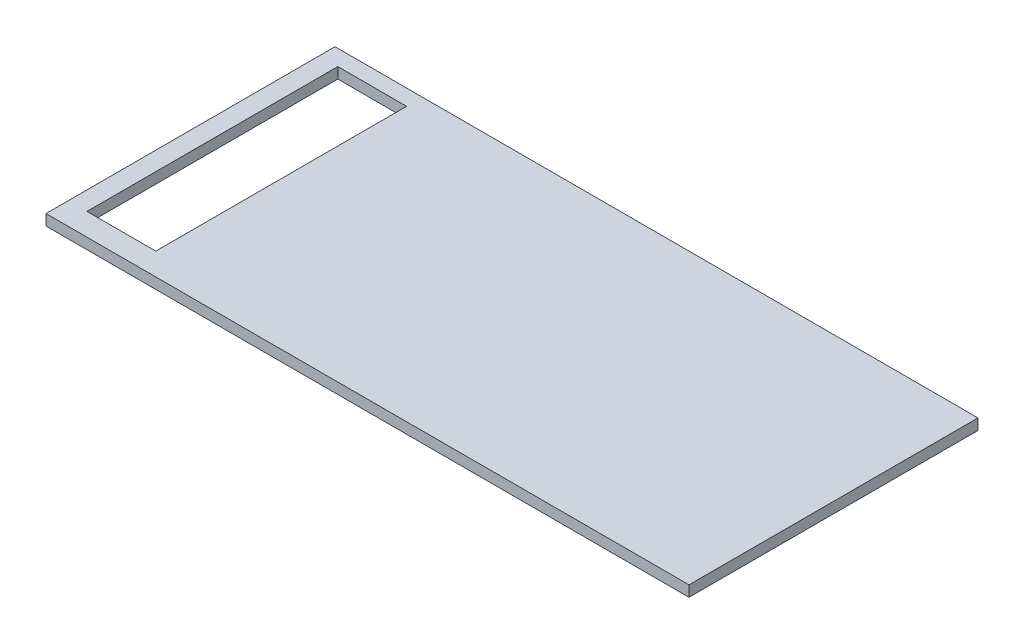
ISO-10303-21;
HEADER;
FILE_DESCRIPTION(('STEP AP214'),'2;1');
FILE_NAME('part.step','',(''),(''),'','','');
FILE_SCHEMA(('AUTOMOTIVE_DESIGN { 1 0 10303 214 1 1 1 1 }'));
ENDSEC;
DATA;
#1=APPLICATION_CONTEXT('core data for automotive mechanical design processes');
#2=APPLICATION_PROTOCOL_DEFINITION('international standard','automotive_design',2000,#1);
#3=PRODUCT_CONTEXT('',#1,'mechanical');
#4=PRODUCT('Part','Part','',(#3));
#5=PRODUCT_RELATED_PRODUCT_CATEGORY('part','',(#4));
#6=PRODUCT_DEFINITION_FORMATION('','',#4);
#7=PRODUCT_DEFINITION_CONTEXT('part definition',#1,'design');
#8=PRODUCT_DEFINITION('design','',#6,#7);
#9=PRODUCT_DEFINITION_SHAPE('','',#8);
#10=(LENGTH_UNIT() NAMED_UNIT(*) SI_UNIT(.MILLI.,.METRE.));
#11=(NAMED_UNIT(*) PLANE_ANGLE_UNIT() SI_UNIT($,.RADIAN.));
#12=(NAMED_UNIT(*) SI_UNIT($,.STERADIAN.) SOLID_ANGLE_UNIT());
#13=UNCERTAINTY_MEASURE_WITH_UNIT(LENGTH_MEASURE(1.E-05),#10,'distance_accuracy_value','');
#14=(GEOMETRIC_REPRESENTATION_CONTEXT(3) GLOBAL_UNCERTAINTY_ASSIGNED_CONTEXT((#13)) GLOBAL_UNIT_ASSIGNED_CONTEXT((#10,
#11,#12)) REPRESENTATION_CONTEXT('',''));
#15=CARTESIAN_POINT('',(0.,0.,0.));
#16=DIRECTION('',(0.,0.,1.));
#17=DIRECTION('',(1.,0.,0.));
#18=AXIS2_PLACEMENT_3D('',#15,#16,#17);
#19=CARTESIAN_POINT('',(0.,1.5,0.));
#20=DIRECTION('',(1.,0.,0.));
#21=DIRECTION('',(0.,0.,-1.));
#22=AXIS2_PLACEMENT_3D('',#19,#20,#21);
#23=PLANE('',#22);
#24=DIRECTION('',(0.,0.,1.));
#25=VECTOR('',#24,1.);
#26=CARTESIAN_POINT('',(0.,0.,0.));
#27=LINE('',#26,#25);
#28=CARTESIAN_POINT('',(0.,0.,-40.));
#29=VERTEX_POINT('',#28);
#30=CARTESIAN_POINT('',(0.,0.,0.));
#31=VERTEX_POINT('',#30);
#32=EDGE_CURVE('E150',#29,#31,#27,.T.);
#33=ORIENTED_EDGE('',*,*,#32,.T.);
#34=DIRECTION('',(0.,-1.,0.));
#35=VECTOR('',#34,1.);
#36=CARTESIAN_POINT('',(0.,1.5,0.));
#37=LINE('',#36,#35);
#38=CARTESIAN_POINT('',(0.,1.5,0.));
#39=VERTEX_POINT('',#38);
#40=EDGE_CURVE('E11',#39,#31,#37,.T.);
#41=ORIENTED_EDGE('',*,*,#40,.F.);
#42=DIRECTION('',(0.,0.,1.));
#43=VECTOR('',#42,1.);
#44=CARTESIAN_POINT('',(0.,1.5,0.));
#45=LINE('',#44,#43);
#46=CARTESIAN_POINT('',(0.,1.5,-40.));
#47=VERTEX_POINT('',#46);
#48=EDGE_CURVE('E151',#47,#39,#45,.T.);
#49=ORIENTED_EDGE('',*,*,#48,.F.);
#50=DIRECTION('',(0.,-1.,0.));
#51=VECTOR('',#50,1.);
#52=CARTESIAN_POINT('',(0.,1.5,-40.));
#53=LINE('',#52,#51);
#54=EDGE_CURVE('E165',#47,#29,#53,.T.);
#55=ORIENTED_EDGE('',*,*,#54,.T.);
#56=EDGE_LOOP('',(#33,#41,#49,#55));
#57=FACE_BOUND('',#56,.T.);
#58=ADVANCED_FACE('F39',(#57),#23,.F.);
#59=CARTESIAN_POINT('',(0.,1.5,0.));
#60=DIRECTION('',(0.,0.,-1.));
#61=DIRECTION('',(-1.,0.,0.));
#62=AXIS2_PLACEMENT_3D('',#59,#60,#61);
#63=PLANE('',#62);
#64=DIRECTION('',(1.,0.,0.));
#65=VECTOR('',#64,1.);
#66=CARTESIAN_POINT('',(0.,0.,0.));
#67=LINE('',#66,#65);
#68=CARTESIAN_POINT('',(89.,0.,0.));
#69=VERTEX_POINT('',#68);
#70=EDGE_CURVE('E169',#31,#69,#67,.T.);
#71=ORIENTED_EDGE('',*,*,#70,.T.);
#72=DIRECTION('',(0.,-1.,0.));
#73=VECTOR('',#72,1.);
#74=CARTESIAN_POINT('',(89.,1.5,0.));
#75=LINE('',#74,#73);
#76=CARTESIAN_POINT('',(89.,1.5,0.));
#77=VERTEX_POINT('',#76);
#78=EDGE_CURVE('E47',#77,#69,#75,.T.);
#79=ORIENTED_EDGE('',*,*,#78,.F.);
#80=DIRECTION('',(1.,0.,0.));
#81=VECTOR('',#80,1.);
#82=CARTESIAN_POINT('',(0.,1.5,0.));
#83=LINE('',#82,#81);
#84=EDGE_CURVE('E155',#39,#77,#83,.T.);
#85=ORIENTED_EDGE('',*,*,#84,.F.);
#86=ORIENTED_EDGE('',*,*,#40,.T.);
#87=EDGE_LOOP('',(#71,#79,#85,#86));
#88=FACE_BOUND('',#87,.T.);
#89=ADVANCED_FACE('F203',(#88),#63,.F.);
#90=CARTESIAN_POINT('',(89.,1.5,0.));
#91=DIRECTION('',(-1.,0.,0.));
#92=DIRECTION('',(0.,0.,1.));
#93=AXIS2_PLACEMENT_3D('',#90,#91,#92);
#94=PLANE('',#93);
#95=DIRECTION('',(0.,0.,-1.));
#96=VECTOR('',#95,1.);
#97=CARTESIAN_POINT('',(89.,0.,0.));
#98=LINE('',#97,#96);
#99=CARTESIAN_POINT('',(89.,0.,-40.));
#100=VERTEX_POINT('',#99);
#101=EDGE_CURVE('E172',#69,#100,#98,.T.);
#102=ORIENTED_EDGE('',*,*,#101,.T.);
#103=DIRECTION('',(0.,-1.,0.));
#104=VECTOR('',#103,1.);
#105=CARTESIAN_POINT('',(89.,1.5,-40.));
#106=LINE('',#105,#104);
#107=CARTESIAN_POINT('',(89.,1.5,-40.));
#108=VERTEX_POINT('',#107);
#109=EDGE_CURVE('E180',#108,#100,#106,.T.);
#110=ORIENTED_EDGE('',*,*,#109,.F.);
#111=DIRECTION('',(0.,0.,-1.));
#112=VECTOR('',#111,1.);
#113=CARTESIAN_POINT('',(89.,1.5,0.));
#114=LINE('',#113,#112);
#115=EDGE_CURVE('E159',#77,#108,#114,.T.);
#116=ORIENTED_EDGE('',*,*,#115,.F.);
#117=ORIENTED_EDGE('',*,*,#78,.T.);
#118=EDGE_LOOP('',(#102,#110,#116,#117));
#119=FACE_BOUND('',#118,.T.);
#120=ADVANCED_FACE('F189',(#119),#94,.F.);
#121=CARTESIAN_POINT('',(0.,1.5,-40.));
#122=DIRECTION('',(0.,0.,1.));
#123=DIRECTION('',(1.,0.,0.));
#124=AXIS2_PLACEMENT_3D('',#121,#122,#123);
#125=PLANE('',#124);
#126=DIRECTION('',(-1.,0.,0.));
#127=VECTOR('',#126,1.);
#128=CARTESIAN_POINT('',(0.,0.,-40.));
#129=LINE('',#128,#127);
#130=EDGE_CURVE('E156',#100,#29,#129,.T.);
#131=ORIENTED_EDGE('',*,*,#130,.T.);
#132=ORIENTED_EDGE('',*,*,#54,.F.);
#133=DIRECTION('',(-1.,0.,0.));
#134=VECTOR('',#133,1.);
#135=CARTESIAN_POINT('',(0.,1.5,-40.));
#136=LINE('',#135,#134);
#137=EDGE_CURVE('E162',#108,#47,#136,.T.);
#138=ORIENTED_EDGE('',*,*,#137,.F.);
#139=ORIENTED_EDGE('',*,*,#109,.T.);
#140=EDGE_LOOP('',(#131,#132,#138,#139));
#141=FACE_BOUND('',#140,.T.);
#142=ADVANCED_FACE('F196',(#141),#125,.F.);
#143=CARTESIAN_POINT('',(0.,1.5,0.));
#144=DIRECTION('',(0.,-1.,0.));
#145=DIRECTION('',(0.,0.,-1.));
#146=AXIS2_PLACEMENT_3D('',#143,#144,#145);
#147=PLANE('',#146);
#148=DIRECTION('',(0.,0.,-1.));
#149=VECTOR('',#148,1.);
#150=CARTESIAN_POINT('',(12.0989451914433,1.5,-37.8100523078331));
#151=LINE('',#150,#149);
#152=CARTESIAN_POINT('',(12.0989451914433,1.5,-3.0935188886474));
#153=VERTEX_POINT('',#152);
#154=CARTESIAN_POINT('',(12.0989451914433,1.5,-37.8100523078331));
#155=VERTEX_POINT('',#154);
#156=EDGE_CURVE('E132',#153,#155,#151,.T.);
#157=ORIENTED_EDGE('',*,*,#156,.F.);
#158=DIRECTION('',(1.,0.,0.));
#159=VECTOR('',#158,1.);
#160=CARTESIAN_POINT('',(2.57661766249839,1.5,-3.0935188886474));
#161=LINE('',#160,#159);
#162=CARTESIAN_POINT('',(2.57661766249839,1.5,-3.0935188886474));
#163=VERTEX_POINT('',#162);
#164=EDGE_CURVE('E122',#163,#153,#161,.T.);
#165=ORIENTED_EDGE('',*,*,#164,.F.);
#166=DIRECTION('',(0.,0.,1.));
#167=VECTOR('',#166,1.);
#168=CARTESIAN_POINT('',(2.57661766249839,1.5,-37.8100523078331));
#169=LINE('',#168,#167);
#170=CARTESIAN_POINT('',(2.57661766249839,1.5,-37.8100523078331));
#171=VERTEX_POINT('',#170);
#172=EDGE_CURVE('E136',#171,#163,#169,.T.);
#173=ORIENTED_EDGE('',*,*,#172,.F.);
#174=DIRECTION('',(-1.,0.,0.));
#175=VECTOR('',#174,1.);
#176=CARTESIAN_POINT('',(2.57661766249839,1.5,-37.8100523078331));
#177=LINE('',#176,#175);
#178=EDGE_CURVE('E54',#155,#171,#177,.T.);
#179=ORIENTED_EDGE('',*,*,#178,.F.);
#180=EDGE_LOOP('',(#157,#165,#173,#179));
#181=FACE_BOUND('',#180,.T.);
#182=ORIENTED_EDGE('',*,*,#48,.T.);
#183=ORIENTED_EDGE('',*,*,#84,.T.);
#184=ORIENTED_EDGE('',*,*,#115,.T.);
#185=ORIENTED_EDGE('',*,*,#137,.T.);
#186=EDGE_LOOP('',(#182,#183,#184,#185));
#187=FACE_BOUND('',#186,.T.);
#188=ADVANCED_FACE('F202',(#181,#187),#147,.F.);
#189=CARTESIAN_POINT('',(0.,0.,0.));
#190=DIRECTION('',(0.,-1.,0.));
#191=DIRECTION('',(0.,0.,-1.));
#192=AXIS2_PLACEMENT_3D('',#189,#190,#191);
#193=PLANE('',#192);
#194=DIRECTION('',(1.,0.,0.));
#195=VECTOR('',#194,1.);
#196=CARTESIAN_POINT('',(2.57661766249839,0.,-3.0935188886474));
#197=LINE('',#196,#195);
#198=CARTESIAN_POINT('',(2.57661766249839,0.,-3.0935188886474));
#199=VERTEX_POINT('',#198);
#200=CARTESIAN_POINT('',(12.0989451914433,0.,-3.0935188886474));
#201=VERTEX_POINT('',#200);
#202=EDGE_CURVE('E119',#199,#201,#197,.T.);
#203=ORIENTED_EDGE('',*,*,#202,.T.);
#204=DIRECTION('',(0.,0.,-1.));
#205=VECTOR('',#204,1.);
#206=CARTESIAN_POINT('',(12.0989451914433,0.,-37.8100523078331));
#207=LINE('',#206,#205);
#208=CARTESIAN_POINT('',(12.0989451914433,0.,-37.8100523078331));
#209=VERTEX_POINT('',#208);
#210=EDGE_CURVE('E105',#201,#209,#207,.T.);
#211=ORIENTED_EDGE('',*,*,#210,.T.);
#212=DIRECTION('',(-1.,0.,0.));
#213=VECTOR('',#212,1.);
#214=CARTESIAN_POINT('',(2.57661766249839,0.,-37.8100523078331));
#215=LINE('',#214,#213);
#216=CARTESIAN_POINT('',(2.57661766249839,0.,-37.8100523078331));
#217=VERTEX_POINT('',#216);
#218=EDGE_CURVE('E141',#209,#217,#215,.T.);
#219=ORIENTED_EDGE('',*,*,#218,.T.);
#220=DIRECTION('',(0.,0.,1.));
#221=VECTOR('',#220,1.);
#222=CARTESIAN_POINT('',(2.57661766249839,0.,-37.8100523078331));
#223=LINE('',#222,#221);
#224=EDGE_CURVE('E128',#217,#199,#223,.T.);
#225=ORIENTED_EDGE('',*,*,#224,.T.);
#226=EDGE_LOOP('',(#203,#211,#219,#225));
#227=FACE_BOUND('',#226,.T.);
#228=ORIENTED_EDGE('',*,*,#32,.F.);
#229=ORIENTED_EDGE('',*,*,#130,.F.);
#230=ORIENTED_EDGE('',*,*,#101,.F.);
#231=ORIENTED_EDGE('',*,*,#70,.F.);
#232=EDGE_LOOP('',(#228,#229,#230,#231));
#233=FACE_BOUND('',#232,.T.);
#234=ADVANCED_FACE('F126',(#227,#233),#193,.T.);
#235=CARTESIAN_POINT('',(2.57661766249839,-35.9987835101957,-3.0935188886474));
#236=DIRECTION('',(0.,0.,1.));
#237=DIRECTION('',(1.,0.,0.));
#238=AXIS2_PLACEMENT_3D('',#235,#236,#237);
#239=PLANE('',#238);
#240=DIRECTION('',(0.,1.,0.));
#241=VECTOR('',#240,1.);
#242=CARTESIAN_POINT('',(2.57661766249839,-35.9987835101957,-3.0935188886474));
#243=LINE('',#242,#241);
#244=EDGE_CURVE('E62',#199,#163,#243,.T.);
#245=ORIENTED_EDGE('',*,*,#244,.T.);
#246=ORIENTED_EDGE('',*,*,#164,.T.);
#247=DIRECTION('',(0.,1.,0.));
#248=VECTOR('',#247,1.);
#249=CARTESIAN_POINT('',(12.0989451914433,-35.9987835101957,-3.0935188886474));
#250=LINE('',#249,#248);
#251=EDGE_CURVE('E109',#201,#153,#250,.T.);
#252=ORIENTED_EDGE('',*,*,#251,.F.);
#253=ORIENTED_EDGE('',*,*,#202,.F.);
#254=EDGE_LOOP('',(#245,#246,#252,#253));
#255=FACE_BOUND('',#254,.T.);
#256=ADVANCED_FACE('F118',(#255),#239,.F.);
#257=CARTESIAN_POINT('',(12.0989451914433,-35.9987835101957,-37.8100523078331));
#258=DIRECTION('',(1.,0.,0.));
#259=DIRECTION('',(0.,0.,-1.));
#260=AXIS2_PLACEMENT_3D('',#257,#258,#259);
#261=PLANE('',#260);
#262=ORIENTED_EDGE('',*,*,#251,.T.);
#263=ORIENTED_EDGE('',*,*,#156,.T.);
#264=DIRECTION('',(0.,1.,0.));
#265=VECTOR('',#264,1.);
#266=CARTESIAN_POINT('',(12.0989451914433,-35.9987835101957,-37.8100523078331));
#267=LINE('',#266,#265);
#268=EDGE_CURVE('E111',#209,#155,#267,.T.);
#269=ORIENTED_EDGE('',*,*,#268,.F.);
#270=ORIENTED_EDGE('',*,*,#210,.F.);
#271=EDGE_LOOP('',(#262,#263,#269,#270));
#272=FACE_BOUND('',#271,.T.);
#273=ADVANCED_FACE('F107',(#272),#261,.F.);
#274=CARTESIAN_POINT('',(2.57661766249839,-35.9987835101957,-37.8100523078331));
#275=DIRECTION('',(0.,0.,-1.));
#276=DIRECTION('',(-1.,0.,0.));
#277=AXIS2_PLACEMENT_3D('',#274,#275,#276);
#278=PLANE('',#277);
#279=ORIENTED_EDGE('',*,*,#268,.T.);
#280=ORIENTED_EDGE('',*,*,#178,.T.);
#281=DIRECTION('',(0.,1.,0.));
#282=VECTOR('',#281,1.);
#283=CARTESIAN_POINT('',(2.57661766249839,-35.9987835101957,-37.8100523078331));
#284=LINE('',#283,#282);
#285=EDGE_CURVE('E140',#217,#171,#284,.T.);
#286=ORIENTED_EDGE('',*,*,#285,.F.);
#287=ORIENTED_EDGE('',*,*,#218,.F.);
#288=EDGE_LOOP('',(#279,#280,#286,#287));
#289=FACE_BOUND('',#288,.T.);
#290=ADVANCED_FACE('F222',(#289),#278,.F.);
#291=CARTESIAN_POINT('',(2.57661766249839,-35.9987835101957,-37.8100523078331));
#292=DIRECTION('',(-1.,0.,0.));
#293=DIRECTION('',(0.,0.,1.));
#294=AXIS2_PLACEMENT_3D('',#291,#292,#293);
#295=PLANE('',#294);
#296=ORIENTED_EDGE('',*,*,#285,.T.);
#297=ORIENTED_EDGE('',*,*,#172,.T.);
#298=ORIENTED_EDGE('',*,*,#244,.F.);
#299=ORIENTED_EDGE('',*,*,#224,.F.);
#300=EDGE_LOOP('',(#296,#297,#298,#299));
#301=FACE_BOUND('',#300,.T.);
#302=ADVANCED_FACE('F225',(#301),#295,.F.);
#303=CLOSED_SHELL('',(#58,#89,#120,#142,#188,#234,#256,#273,#290,#302));
#304=MANIFOLD_SOLID_BREP('B2',#303);
#305=ADVANCED_BREP_SHAPE_REPRESENTATION('',(#18,#304),#14);
#306=SHAPE_DEFINITION_REPRESENTATION(#9,#305);
ENDSEC;
END-ISO-10303-21;
